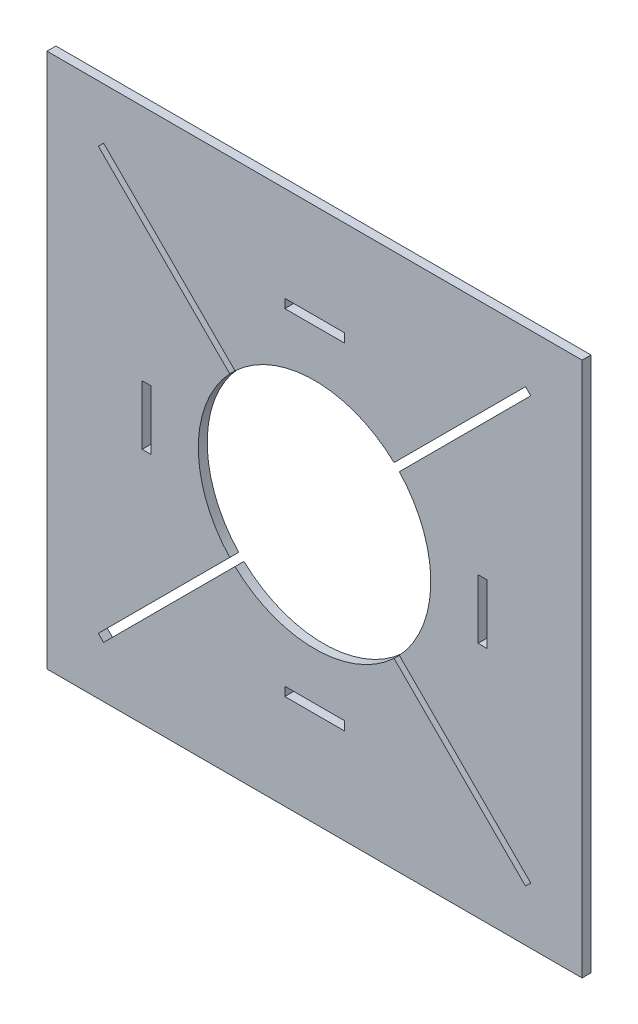
ISO-10303-21;
HEADER;
FILE_DESCRIPTION(('STEP AP214'),'2;1');
FILE_NAME('part.step','',(''),(''),'','','');
FILE_SCHEMA(('AUTOMOTIVE_DESIGN { 1 0 10303 214 1 1 1 1 }'));
ENDSEC;
DATA;
#1=APPLICATION_CONTEXT('core data for automotive mechanical design processes');
#2=APPLICATION_PROTOCOL_DEFINITION('international standard','automotive_design',2000,#1);
#3=PRODUCT_CONTEXT('',#1,'mechanical');
#4=PRODUCT('Part','Part','',(#3));
#5=PRODUCT_RELATED_PRODUCT_CATEGORY('part','',(#4));
#6=PRODUCT_DEFINITION_FORMATION('','',#4);
#7=PRODUCT_DEFINITION_CONTEXT('part definition',#1,'design');
#8=PRODUCT_DEFINITION('design','',#6,#7);
#9=PRODUCT_DEFINITION_SHAPE('','',#8);
#10=(LENGTH_UNIT() NAMED_UNIT(*) SI_UNIT(.MILLI.,.METRE.));
#11=(NAMED_UNIT(*) PLANE_ANGLE_UNIT() SI_UNIT($,.RADIAN.));
#12=(NAMED_UNIT(*) SI_UNIT($,.STERADIAN.) SOLID_ANGLE_UNIT());
#13=UNCERTAINTY_MEASURE_WITH_UNIT(LENGTH_MEASURE(1.E-05),#10,'distance_accuracy_value','');
#14=(GEOMETRIC_REPRESENTATION_CONTEXT(3) GLOBAL_UNCERTAINTY_ASSIGNED_CONTEXT((#13)) GLOBAL_UNIT_ASSIGNED_CONTEXT((#10,
#11,#12)) REPRESENTATION_CONTEXT('',''));
#15=CARTESIAN_POINT('',(0.,0.,0.));
#16=DIRECTION('',(0.,0.,1.));
#17=DIRECTION('',(1.,0.,0.));
#18=AXIS2_PLACEMENT_3D('',#15,#16,#17);
#19=CARTESIAN_POINT('',(0.,0.,0.));
#20=DIRECTION('',(0.,0.,1.));
#21=DIRECTION('',(1.,0.,0.));
#22=AXIS2_PLACEMENT_3D('',#19,#20,#21);
#23=CYLINDRICAL_SURFACE('',#22,78.2);
#24=CARTESIAN_POINT('',(0.,0.,0.));
#25=DIRECTION('',(0.,0.,1.));
#26=DIRECTION('',(1.,0.,0.));
#27=AXIS2_PLACEMENT_3D('',#24,#25,#26);
#28=CIRCLE('',#27,78.2);
#29=CARTESIAN_POINT('',(-53.4997189677804,-57.0352528737141,0.));
#30=VERTEX_POINT('',#29);
#31=CARTESIAN_POINT('',(53.4997189677812,-57.0352528737133,0.));
#32=VERTEX_POINT('',#31);
#33=EDGE_CURVE('E505',#30,#32,#28,.T.);
#34=ORIENTED_EDGE('',*,*,#33,.F.);
#35=DIRECTION('',(0.,0.,1.));
#36=VECTOR('',#35,1.);
#37=CARTESIAN_POINT('',(-53.4997189677804,-57.0352528737141,0.));
#38=LINE('',#37,#36);
#39=CARTESIAN_POINT('',(-53.4997189677804,-57.0352528737141,6.));
#40=VERTEX_POINT('',#39);
#41=EDGE_CURVE('E415',#30,#40,#38,.T.);
#42=ORIENTED_EDGE('',*,*,#41,.T.);
#43=CARTESIAN_POINT('',(0.,0.,6.));
#44=DIRECTION('',(0.,0.,1.));
#45=DIRECTION('',(1.,0.,0.));
#46=AXIS2_PLACEMENT_3D('',#43,#44,#45);
#47=CIRCLE('',#46,78.2);
#48=CARTESIAN_POINT('',(53.4997189677812,-57.0352528737133,6.));
#49=VERTEX_POINT('',#48);
#50=EDGE_CURVE('E510',#40,#49,#47,.T.);
#51=ORIENTED_EDGE('',*,*,#50,.T.);
#52=DIRECTION('',(0.,0.,1.));
#53=VECTOR('',#52,1.);
#54=CARTESIAN_POINT('',(53.4997189677812,-57.0352528737133,0.));
#55=LINE('',#54,#53);
#56=EDGE_CURVE('E434',#32,#49,#55,.T.);
#57=ORIENTED_EDGE('',*,*,#56,.F.);
#58=EDGE_LOOP('',(#34,#42,#51,#57));
#59=FACE_BOUND('',#58,.T.);
#60=ADVANCED_FACE('F33',(#59),#23,.F.);
#61=CARTESIAN_POINT('',(57.0352528737139,-53.4997189677806,0.));
#62=VERTEX_POINT('',#61);
#63=CARTESIAN_POINT('',(57.0352528737128,53.4997189677818,0.));
#64=VERTEX_POINT('',#63);
#65=EDGE_CURVE('E593',#62,#64,#28,.T.);
#66=ORIENTED_EDGE('',*,*,#65,.F.);
#67=DIRECTION('',(0.,0.,1.));
#68=VECTOR('',#67,1.);
#69=CARTESIAN_POINT('',(57.0352528737139,-53.4997189677806,0.));
#70=LINE('',#69,#68);
#71=CARTESIAN_POINT('',(57.0352528737139,-53.4997189677806,6.));
#72=VERTEX_POINT('',#71);
#73=EDGE_CURVE('E411',#62,#72,#70,.T.);
#74=ORIENTED_EDGE('',*,*,#73,.T.);
#75=CARTESIAN_POINT('',(57.0352528737128,53.4997189677818,6.));
#76=VERTEX_POINT('',#75);
#77=EDGE_CURVE('E616',#72,#76,#47,.T.);
#78=ORIENTED_EDGE('',*,*,#77,.T.);
#79=DIRECTION('',(0.,0.,1.));
#80=VECTOR('',#79,1.);
#81=CARTESIAN_POINT('',(57.0352528737128,53.4997189677818,0.));
#82=LINE('',#81,#80);
#83=EDGE_CURVE('E460',#64,#76,#82,.T.);
#84=ORIENTED_EDGE('',*,*,#83,.F.);
#85=EDGE_LOOP('',(#66,#74,#78,#84));
#86=FACE_BOUND('',#85,.T.);
#87=ADVANCED_FACE('F562',(#86),#23,.F.);
#88=CARTESIAN_POINT('',(53.49971896778,57.0352528737145,0.));
#89=VERTEX_POINT('',#88);
#90=CARTESIAN_POINT('',(-53.4997189677812,57.0352528737133,0.));
#91=VERTEX_POINT('',#90);
#92=EDGE_CURVE('E506',#89,#91,#28,.T.);
#93=ORIENTED_EDGE('',*,*,#92,.F.);
#94=DIRECTION('',(0.,0.,1.));
#95=VECTOR('',#94,1.);
#96=CARTESIAN_POINT('',(53.49971896778,57.0352528737145,0.));
#97=LINE('',#96,#95);
#98=CARTESIAN_POINT('',(53.49971896778,57.0352528737145,6.));
#99=VERTEX_POINT('',#98);
#100=EDGE_CURVE('E439',#89,#99,#97,.T.);
#101=ORIENTED_EDGE('',*,*,#100,.T.);
#102=CARTESIAN_POINT('',(-53.4997189677812,57.0352528737133,6.));
#103=VERTEX_POINT('',#102);
#104=EDGE_CURVE('E494',#99,#103,#47,.T.);
#105=ORIENTED_EDGE('',*,*,#104,.T.);
#106=DIRECTION('',(0.,0.,1.));
#107=VECTOR('',#106,1.);
#108=CARTESIAN_POINT('',(-53.4997189677812,57.0352528737133,0.));
#109=LINE('',#108,#107);
#110=EDGE_CURVE('E484',#91,#103,#109,.T.);
#111=ORIENTED_EDGE('',*,*,#110,.F.);
#112=EDGE_LOOP('',(#93,#101,#105,#111));
#113=FACE_BOUND('',#112,.T.);
#114=ADVANCED_FACE('F560',(#113),#23,.F.);
#115=CARTESIAN_POINT('',(-180.,-180.,6.));
#116=DIRECTION('',(1.,0.,0.));
#117=DIRECTION('',(0.,0.,-1.));
#118=AXIS2_PLACEMENT_3D('',#115,#116,#117);
#119=PLANE('',#118);
#120=DIRECTION('',(0.,-1.,0.));
#121=VECTOR('',#120,1.);
#122=CARTESIAN_POINT('',(-180.,-180.,0.));
#123=LINE('',#122,#121);
#124=CARTESIAN_POINT('',(-180.,180.,0.));
#125=VERTEX_POINT('',#124);
#126=CARTESIAN_POINT('',(-180.,-180.,0.));
#127=VERTEX_POINT('',#126);
#128=EDGE_CURVE('E504',#125,#127,#123,.T.);
#129=ORIENTED_EDGE('',*,*,#128,.T.);
#130=DIRECTION('',(0.,0.,-1.));
#131=VECTOR('',#130,1.);
#132=CARTESIAN_POINT('',(-180.,-180.,6.));
#133=LINE('',#132,#131);
#134=CARTESIAN_POINT('',(-180.,-180.,6.));
#135=VERTEX_POINT('',#134);
#136=EDGE_CURVE('E11',#135,#127,#133,.T.);
#137=ORIENTED_EDGE('',*,*,#136,.F.);
#138=DIRECTION('',(0.,-1.,0.));
#139=VECTOR('',#138,1.);
#140=CARTESIAN_POINT('',(-180.,-180.,6.));
#141=LINE('',#140,#139);
#142=CARTESIAN_POINT('',(-180.,180.,6.));
#143=VERTEX_POINT('',#142);
#144=EDGE_CURVE('E511',#143,#135,#141,.T.);
#145=ORIENTED_EDGE('',*,*,#144,.F.);
#146=DIRECTION('',(0.,0.,-1.));
#147=VECTOR('',#146,1.);
#148=CARTESIAN_POINT('',(-180.,180.,6.));
#149=LINE('',#148,#147);
#150=EDGE_CURVE('E521',#143,#125,#149,.T.);
#151=ORIENTED_EDGE('',*,*,#150,.T.);
#152=EDGE_LOOP('',(#129,#137,#145,#151));
#153=FACE_BOUND('',#152,.T.);
#154=ADVANCED_FACE('F35',(#153),#119,.F.);
#155=CARTESIAN_POINT('',(-180.,-180.,6.));
#156=DIRECTION('',(0.,1.,0.));
#157=DIRECTION('',(0.,0.,1.));
#158=AXIS2_PLACEMENT_3D('',#155,#156,#157);
#159=PLANE('',#158);
#160=DIRECTION('',(1.,0.,0.));
#161=VECTOR('',#160,1.);
#162=CARTESIAN_POINT('',(-180.,-180.,0.));
#163=LINE('',#162,#161);
#164=CARTESIAN_POINT('',(180.,-180.,0.));
#165=VERTEX_POINT('',#164);
#166=EDGE_CURVE('E524',#127,#165,#163,.T.);
#167=ORIENTED_EDGE('',*,*,#166,.T.);
#168=DIRECTION('',(0.,0.,-1.));
#169=VECTOR('',#168,1.);
#170=CARTESIAN_POINT('',(180.,-180.,6.));
#171=LINE('',#170,#169);
#172=CARTESIAN_POINT('',(180.,-180.,6.));
#173=VERTEX_POINT('',#172);
#174=EDGE_CURVE('E41',#173,#165,#171,.T.);
#175=ORIENTED_EDGE('',*,*,#174,.F.);
#176=DIRECTION('',(1.,0.,0.));
#177=VECTOR('',#176,1.);
#178=CARTESIAN_POINT('',(-180.,-180.,6.));
#179=LINE('',#178,#177);
#180=EDGE_CURVE('E514',#135,#173,#179,.T.);
#181=ORIENTED_EDGE('',*,*,#180,.F.);
#182=ORIENTED_EDGE('',*,*,#136,.T.);
#183=EDGE_LOOP('',(#167,#175,#181,#182));
#184=FACE_BOUND('',#183,.T.);
#185=ADVANCED_FACE('F553',(#184),#159,.F.);
#186=CARTESIAN_POINT('',(180.,-180.,6.));
#187=DIRECTION('',(-1.,0.,0.));
#188=DIRECTION('',(0.,0.,1.));
#189=AXIS2_PLACEMENT_3D('',#186,#187,#188);
#190=PLANE('',#189);
#191=DIRECTION('',(0.,1.,0.));
#192=VECTOR('',#191,1.);
#193=CARTESIAN_POINT('',(180.,-180.,0.));
#194=LINE('',#193,#192);
#195=CARTESIAN_POINT('',(180.,180.,0.));
#196=VERTEX_POINT('',#195);
#197=EDGE_CURVE('E526',#165,#196,#194,.T.);
#198=ORIENTED_EDGE('',*,*,#197,.T.);
#199=DIRECTION('',(0.,0.,-1.));
#200=VECTOR('',#199,1.);
#201=CARTESIAN_POINT('',(180.,180.,6.));
#202=LINE('',#201,#200);
#203=CARTESIAN_POINT('',(180.,180.,6.));
#204=VERTEX_POINT('',#203);
#205=EDGE_CURVE('E531',#204,#196,#202,.T.);
#206=ORIENTED_EDGE('',*,*,#205,.F.);
#207=DIRECTION('',(0.,1.,0.));
#208=VECTOR('',#207,1.);
#209=CARTESIAN_POINT('',(180.,-180.,6.));
#210=LINE('',#209,#208);
#211=EDGE_CURVE('E517',#173,#204,#210,.T.);
#212=ORIENTED_EDGE('',*,*,#211,.F.);
#213=ORIENTED_EDGE('',*,*,#174,.T.);
#214=EDGE_LOOP('',(#198,#206,#212,#213));
#215=FACE_BOUND('',#214,.T.);
#216=ADVANCED_FACE('F538',(#215),#190,.F.);
#217=CARTESIAN_POINT('',(-180.,180.,6.));
#218=DIRECTION('',(0.,-1.,0.));
#219=DIRECTION('',(0.,0.,-1.));
#220=AXIS2_PLACEMENT_3D('',#217,#218,#219);
#221=PLANE('',#220);
#222=DIRECTION('',(-1.,0.,0.));
#223=VECTOR('',#222,1.);
#224=CARTESIAN_POINT('',(-180.,180.,0.));
#225=LINE('',#224,#223);
#226=EDGE_CURVE('E515',#196,#125,#225,.T.);
#227=ORIENTED_EDGE('',*,*,#226,.T.);
#228=ORIENTED_EDGE('',*,*,#150,.F.);
#229=DIRECTION('',(-1.,0.,0.));
#230=VECTOR('',#229,1.);
#231=CARTESIAN_POINT('',(-180.,180.,6.));
#232=LINE('',#231,#230);
#233=EDGE_CURVE('E519',#204,#143,#232,.T.);
#234=ORIENTED_EDGE('',*,*,#233,.F.);
#235=ORIENTED_EDGE('',*,*,#205,.T.);
#236=EDGE_LOOP('',(#227,#228,#234,#235));
#237=FACE_BOUND('',#236,.T.);
#238=ADVANCED_FACE('F546',(#237),#221,.F.);
#239=CARTESIAN_POINT('',(0.,0.,6.));
#240=DIRECTION('',(0.,0.,-1.));
#241=DIRECTION('',(-1.,0.,0.));
#242=AXIS2_PLACEMENT_3D('',#239,#240,#241);
#243=PLANE('',#242);
#244=DIRECTION('',(0.,1.,0.));
#245=VECTOR('',#244,1.);
#246=CARTESIAN_POINT('',(-110.,-20.0000000000004,6.));
#247=LINE('',#246,#245);
#248=CARTESIAN_POINT('',(-110.,-20.0000000000004,6.));
#249=VERTEX_POINT('',#248);
#250=CARTESIAN_POINT('',(-110.,19.9999999999996,6.));
#251=VERTEX_POINT('',#250);
#252=EDGE_CURVE('E295',#249,#251,#247,.T.);
#253=ORIENTED_EDGE('',*,*,#252,.F.);
#254=DIRECTION('',(1.,0.,0.));
#255=VECTOR('',#254,1.);
#256=CARTESIAN_POINT('',(-116.,-20.0000000000004,6.));
#257=LINE('',#256,#255);
#258=CARTESIAN_POINT('',(-116.,-20.0000000000004,6.));
#259=VERTEX_POINT('',#258);
#260=EDGE_CURVE('E48',#259,#249,#257,.T.);
#261=ORIENTED_EDGE('',*,*,#260,.F.);
#262=DIRECTION('',(0.,1.,0.));
#263=VECTOR('',#262,1.);
#264=CARTESIAN_POINT('',(-116.,-20.0000000000004,6.));
#265=LINE('',#264,#263);
#266=CARTESIAN_POINT('',(-116.,19.9999999999996,6.));
#267=VERTEX_POINT('',#266);
#268=EDGE_CURVE('E286',#259,#267,#265,.T.);
#269=ORIENTED_EDGE('',*,*,#268,.T.);
#270=DIRECTION('',(1.,0.,0.));
#271=VECTOR('',#270,1.);
#272=CARTESIAN_POINT('',(-116.,19.9999999999996,6.));
#273=LINE('',#272,#271);
#274=EDGE_CURVE('E289',#267,#251,#273,.T.);
#275=ORIENTED_EDGE('',*,*,#274,.T.);
#276=EDGE_LOOP('',(#253,#261,#269,#275));
#277=FACE_BOUND('',#276,.T.);
#278=DIRECTION('',(-1.,0.,0.));
#279=VECTOR('',#278,1.);
#280=CARTESIAN_POINT('',(20.,-110.,6.));
#281=LINE('',#280,#279);
#282=CARTESIAN_POINT('',(20.,-110.,6.));
#283=VERTEX_POINT('',#282);
#284=CARTESIAN_POINT('',(-20.,-110.,6.));
#285=VERTEX_POINT('',#284);
#286=EDGE_CURVE('E320',#283,#285,#281,.T.);
#287=ORIENTED_EDGE('',*,*,#286,.F.);
#288=DIRECTION('',(0.,1.,0.));
#289=VECTOR('',#288,1.);
#290=CARTESIAN_POINT('',(20.,-116.,6.));
#291=LINE('',#290,#289);
#292=CARTESIAN_POINT('',(20.,-116.,6.));
#293=VERTEX_POINT('',#292);
#294=EDGE_CURVE('E56',#293,#283,#291,.T.);
#295=ORIENTED_EDGE('',*,*,#294,.F.);
#296=DIRECTION('',(-1.,0.,0.));
#297=VECTOR('',#296,1.);
#298=CARTESIAN_POINT('',(20.,-116.,6.));
#299=LINE('',#298,#297);
#300=CARTESIAN_POINT('',(-20.,-116.,6.));
#301=VERTEX_POINT('',#300);
#302=EDGE_CURVE('E310',#293,#301,#299,.T.);
#303=ORIENTED_EDGE('',*,*,#302,.T.);
#304=DIRECTION('',(0.,1.,0.));
#305=VECTOR('',#304,1.);
#306=CARTESIAN_POINT('',(-20.,-116.,6.));
#307=LINE('',#306,#305);
#308=EDGE_CURVE('E324',#301,#285,#307,.T.);
#309=ORIENTED_EDGE('',*,*,#308,.T.);
#310=EDGE_LOOP('',(#287,#295,#303,#309));
#311=FACE_BOUND('',#310,.T.);
#312=DIRECTION('',(0.,-1.,0.));
#313=VECTOR('',#312,1.);
#314=CARTESIAN_POINT('',(110.,20.0000000000012,6.));
#315=LINE('',#314,#313);
#316=CARTESIAN_POINT('',(110.,20.0000000000012,6.));
#317=VERTEX_POINT('',#316);
#318=CARTESIAN_POINT('',(110.,-19.9999999999988,6.));
#319=VERTEX_POINT('',#318);
#320=EDGE_CURVE('E350',#317,#319,#315,.T.);
#321=ORIENTED_EDGE('',*,*,#320,.F.);
#322=DIRECTION('',(-1.,0.,0.));
#323=VECTOR('',#322,1.);
#324=CARTESIAN_POINT('',(116.,20.0000000000012,6.));
#325=LINE('',#324,#323);
#326=CARTESIAN_POINT('',(116.,20.0000000000012,6.));
#327=VERTEX_POINT('',#326);
#328=EDGE_CURVE('E348',#327,#317,#325,.T.);
#329=ORIENTED_EDGE('',*,*,#328,.F.);
#330=DIRECTION('',(0.,-1.,0.));
#331=VECTOR('',#330,1.);
#332=CARTESIAN_POINT('',(116.,20.0000000000012,6.));
#333=LINE('',#332,#331);
#334=CARTESIAN_POINT('',(116.,-19.9999999999988,6.));
#335=VERTEX_POINT('',#334);
#336=EDGE_CURVE('E339',#327,#335,#333,.T.);
#337=ORIENTED_EDGE('',*,*,#336,.T.);
#338=DIRECTION('',(-1.,0.,0.));
#339=VECTOR('',#338,1.);
#340=CARTESIAN_POINT('',(116.,-19.9999999999988,6.));
#341=LINE('',#340,#339);
#342=EDGE_CURVE('E353',#335,#319,#341,.T.);
#343=ORIENTED_EDGE('',*,*,#342,.T.);
#344=EDGE_LOOP('',(#321,#329,#337,#343));
#345=FACE_BOUND('',#344,.T.);
#346=DIRECTION('',(1.,0.,0.));
#347=VECTOR('',#346,1.);
#348=CARTESIAN_POINT('',(-20.,110.,6.));
#349=LINE('',#348,#347);
#350=CARTESIAN_POINT('',(-20.,110.,6.));
#351=VERTEX_POINT('',#350);
#352=CARTESIAN_POINT('',(20.,110.,6.));
#353=VERTEX_POINT('',#352);
#354=EDGE_CURVE('E379',#351,#353,#349,.T.);
#355=ORIENTED_EDGE('',*,*,#354,.F.);
#356=DIRECTION('',(0.,-1.,0.));
#357=VECTOR('',#356,1.);
#358=CARTESIAN_POINT('',(-20.,116.,6.));
#359=LINE('',#358,#357);
#360=CARTESIAN_POINT('',(-20.,116.,6.));
#361=VERTEX_POINT('',#360);
#362=EDGE_CURVE('E302',#361,#351,#359,.T.);
#363=ORIENTED_EDGE('',*,*,#362,.F.);
#364=DIRECTION('',(1.,0.,0.));
#365=VECTOR('',#364,1.);
#366=CARTESIAN_POINT('',(-20.,116.,6.));
#367=LINE('',#366,#365);
#368=CARTESIAN_POINT('',(20.,116.,6.));
#369=VERTEX_POINT('',#368);
#370=EDGE_CURVE('E369',#361,#369,#367,.T.);
#371=ORIENTED_EDGE('',*,*,#370,.T.);
#372=DIRECTION('',(0.,-1.,0.));
#373=VECTOR('',#372,1.);
#374=CARTESIAN_POINT('',(20.,116.,6.));
#375=LINE('',#374,#373);
#376=EDGE_CURVE('E382',#369,#353,#375,.T.);
#377=ORIENTED_EDGE('',*,*,#376,.T.);
#378=EDGE_LOOP('',(#355,#363,#371,#377));
#379=FACE_BOUND('',#378,.T.);
#380=ORIENTED_EDGE('',*,*,#50,.F.);
#381=DIRECTION('',(0.707106781186541,0.707106781186554,0.));
#382=VECTOR('',#381,1.);
#383=CARTESIAN_POINT('',(-53.4997189677804,-57.0352528737141,6.));
#384=LINE('',#383,#382);
#385=CARTESIAN_POINT('',(-141.916330984139,-145.451864890074,6.));
#386=VERTEX_POINT('',#385);
#387=EDGE_CURVE('E400',#386,#40,#384,.T.);
#388=ORIENTED_EDGE('',*,*,#387,.F.);
#389=DIRECTION('',(0.707106781186556,-0.70710678118654,0.));
#390=VECTOR('',#389,1.);
#391=CARTESIAN_POINT('',(-141.916330984139,-145.451864890074,6.));
#392=LINE('',#391,#390);
#393=CARTESIAN_POINT('',(-145.451864890072,-141.916330984141,6.));
#394=VERTEX_POINT('',#393);
#395=EDGE_CURVE('E410',#394,#386,#392,.T.);
#396=ORIENTED_EDGE('',*,*,#395,.F.);
#397=DIRECTION('',(-0.707106781186541,-0.707106781186554,0.));
#398=VECTOR('',#397,1.);
#399=CARTESIAN_POINT('',(-145.451864890072,-141.916330984141,6.));
#400=LINE('',#399,#398);
#401=CARTESIAN_POINT('',(-57.0352528737131,-53.4997189677814,6.));
#402=VERTEX_POINT('',#401);
#403=EDGE_CURVE('E407',#402,#394,#400,.T.);
#404=ORIENTED_EDGE('',*,*,#403,.F.);
#405=CARTESIAN_POINT('',(-57.0352528737139,53.4997189677806,6.));
#406=VERTEX_POINT('',#405);
#407=EDGE_CURVE('E507',#406,#402,#47,.T.);
#408=ORIENTED_EDGE('',*,*,#407,.F.);
#409=DIRECTION('',(0.707106781186551,-0.707106781186544,0.));
#410=VECTOR('',#409,1.);
#411=CARTESIAN_POINT('',(-57.0352528737139,53.4997189677806,6.));
#412=LINE('',#411,#410);
#413=CARTESIAN_POINT('',(-145.451864890074,141.916330984139,6.));
#414=VERTEX_POINT('',#413);
#415=EDGE_CURVE('E478',#414,#406,#412,.T.);
#416=ORIENTED_EDGE('',*,*,#415,.F.);
#417=DIRECTION('',(-0.707106781186542,-0.707106781186553,0.));
#418=VECTOR('',#417,1.);
#419=CARTESIAN_POINT('',(-145.451864890074,141.916330984139,6.));
#420=LINE('',#419,#418);
#421=CARTESIAN_POINT('',(-141.916330984141,145.451864890072,6.));
#422=VERTEX_POINT('',#421);
#423=EDGE_CURVE('E487',#422,#414,#420,.T.);
#424=ORIENTED_EDGE('',*,*,#423,.F.);
#425=DIRECTION('',(-0.707106781186551,0.707106781186543,0.));
#426=VECTOR('',#425,1.);
#427=CARTESIAN_POINT('',(-141.916330984141,145.451864890072,6.));
#428=LINE('',#427,#426);
#429=EDGE_CURVE('E418',#103,#422,#428,.T.);
#430=ORIENTED_EDGE('',*,*,#429,.F.);
#431=ORIENTED_EDGE('',*,*,#104,.F.);
#432=DIRECTION('',(-0.707106781186536,-0.707106781186559,0.));
#433=VECTOR('',#432,1.);
#434=CARTESIAN_POINT('',(53.49971896778,57.0352528737145,6.));
#435=LINE('',#434,#433);
#436=CARTESIAN_POINT('',(141.916330984138,145.451864890075,6.));
#437=VERTEX_POINT('',#436);
#438=EDGE_CURVE('E454',#437,#99,#435,.T.);
#439=ORIENTED_EDGE('',*,*,#438,.F.);
#440=DIRECTION('',(-0.707106781186561,0.707106781186535,0.));
#441=VECTOR('',#440,1.);
#442=CARTESIAN_POINT('',(141.916330984138,145.451864890075,6.));
#443=LINE('',#442,#441);
#444=CARTESIAN_POINT('',(145.451864890071,141.916330984142,6.));
#445=VERTEX_POINT('',#444);
#446=EDGE_CURVE('E463',#445,#437,#443,.T.);
#447=ORIENTED_EDGE('',*,*,#446,.F.);
#448=DIRECTION('',(0.707106781186536,0.707106781186559,0.));
#449=VECTOR('',#448,1.);
#450=CARTESIAN_POINT('',(145.451864890071,141.916330984142,6.));
#451=LINE('',#450,#449);
#452=EDGE_CURVE('E389',#76,#445,#451,.T.);
#453=ORIENTED_EDGE('',*,*,#452,.F.);
#454=ORIENTED_EDGE('',*,*,#77,.F.);
#455=DIRECTION('',(-0.707106781186551,0.707106781186544,0.));
#456=VECTOR('',#455,1.);
#457=CARTESIAN_POINT('',(57.0352528737139,-53.4997189677806,6.));
#458=LINE('',#457,#456);
#459=CARTESIAN_POINT('',(145.451864890074,-141.916330984139,6.));
#460=VERTEX_POINT('',#459);
#461=EDGE_CURVE('E428',#460,#72,#458,.T.);
#462=ORIENTED_EDGE('',*,*,#461,.F.);
#463=DIRECTION('',(0.707106781186542,0.707106781186553,0.));
#464=VECTOR('',#463,1.);
#465=CARTESIAN_POINT('',(145.451864890074,-141.916330984139,6.));
#466=LINE('',#465,#464);
#467=CARTESIAN_POINT('',(141.916330984141,-145.451864890072,6.));
#468=VERTEX_POINT('',#467);
#469=EDGE_CURVE('E438',#468,#460,#466,.T.);
#470=ORIENTED_EDGE('',*,*,#469,.F.);
#471=DIRECTION('',(0.707106781186551,-0.707106781186543,0.));
#472=VECTOR('',#471,1.);
#473=CARTESIAN_POINT('',(141.916330984141,-145.451864890072,6.));
#474=LINE('',#473,#472);
#475=EDGE_CURVE('E435',#49,#468,#474,.T.);
#476=ORIENTED_EDGE('',*,*,#475,.F.);
#477=EDGE_LOOP('',(#380,#388,#396,#404,#408,#416,#424,#430,#431,#439,#447,#453,#454,#462,#470,#476));
#478=FACE_BOUND('',#477,.T.);
#479=ORIENTED_EDGE('',*,*,#144,.T.);
#480=ORIENTED_EDGE('',*,*,#180,.T.);
#481=ORIENTED_EDGE('',*,*,#211,.T.);
#482=ORIENTED_EDGE('',*,*,#233,.T.);
#483=EDGE_LOOP('',(#479,#480,#481,#482));
#484=FACE_BOUND('',#483,.T.);
#485=ADVANCED_FACE('F552',(#277,#311,#345,#379,#478,#484),#243,.F.);
#486=CARTESIAN_POINT('',(0.,0.,0.));
#487=DIRECTION('',(0.,0.,-1.));
#488=DIRECTION('',(-1.,0.,0.));
#489=AXIS2_PLACEMENT_3D('',#486,#487,#488);
#490=PLANE('',#489);
#491=DIRECTION('',(1.,0.,0.));
#492=VECTOR('',#491,1.);
#493=CARTESIAN_POINT('',(-116.,-20.0000000000004,0.));
#494=LINE('',#493,#492);
#495=CARTESIAN_POINT('',(-116.,-20.0000000000004,0.));
#496=VERTEX_POINT('',#495);
#497=CARTESIAN_POINT('',(-110.,-20.0000000000004,0.));
#498=VERTEX_POINT('',#497);
#499=EDGE_CURVE('E268',#496,#498,#494,.T.);
#500=ORIENTED_EDGE('',*,*,#499,.T.);
#501=DIRECTION('',(0.,1.,0.));
#502=VECTOR('',#501,1.);
#503=CARTESIAN_POINT('',(-110.,-20.0000000000004,0.));
#504=LINE('',#503,#502);
#505=CARTESIAN_POINT('',(-110.,19.9999999999996,0.));
#506=VERTEX_POINT('',#505);
#507=EDGE_CURVE('E277',#498,#506,#504,.T.);
#508=ORIENTED_EDGE('',*,*,#507,.T.);
#509=DIRECTION('',(1.,0.,0.));
#510=VECTOR('',#509,1.);
#511=CARTESIAN_POINT('',(-116.,19.9999999999996,0.));
#512=LINE('',#511,#510);
#513=CARTESIAN_POINT('',(-116.,19.9999999999996,0.));
#514=VERTEX_POINT('',#513);
#515=EDGE_CURVE('E282',#514,#506,#512,.T.);
#516=ORIENTED_EDGE('',*,*,#515,.F.);
#517=DIRECTION('',(0.,1.,0.));
#518=VECTOR('',#517,1.);
#519=CARTESIAN_POINT('',(-116.,-20.0000000000004,0.));
#520=LINE('',#519,#518);
#521=EDGE_CURVE('E274',#496,#514,#520,.T.);
#522=ORIENTED_EDGE('',*,*,#521,.F.);
#523=EDGE_LOOP('',(#500,#508,#516,#522));
#524=FACE_BOUND('',#523,.T.);
#525=DIRECTION('',(0.,1.,0.));
#526=VECTOR('',#525,1.);
#527=CARTESIAN_POINT('',(20.,-116.,0.));
#528=LINE('',#527,#526);
#529=CARTESIAN_POINT('',(20.,-116.,0.));
#530=VERTEX_POINT('',#529);
#531=CARTESIAN_POINT('',(20.,-110.,0.));
#532=VERTEX_POINT('',#531);
#533=EDGE_CURVE('E306',#530,#532,#528,.T.);
#534=ORIENTED_EDGE('',*,*,#533,.T.);
#535=DIRECTION('',(-1.,0.,0.));
#536=VECTOR('',#535,1.);
#537=CARTESIAN_POINT('',(20.,-110.,0.));
#538=LINE('',#537,#536);
#539=CARTESIAN_POINT('',(-20.,-110.,0.));
#540=VERTEX_POINT('',#539);
#541=EDGE_CURVE('E309',#532,#540,#538,.T.);
#542=ORIENTED_EDGE('',*,*,#541,.T.);
#543=DIRECTION('',(0.,1.,0.));
#544=VECTOR('',#543,1.);
#545=CARTESIAN_POINT('',(-20.,-116.,0.));
#546=LINE('',#545,#544);
#547=CARTESIAN_POINT('',(-20.,-116.,0.));
#548=VERTEX_POINT('',#547);
#549=EDGE_CURVE('E313',#548,#540,#546,.T.);
#550=ORIENTED_EDGE('',*,*,#549,.F.);
#551=DIRECTION('',(-1.,0.,0.));
#552=VECTOR('',#551,1.);
#553=CARTESIAN_POINT('',(20.,-116.,0.));
#554=LINE('',#553,#552);
#555=EDGE_CURVE('E316',#530,#548,#554,.T.);
#556=ORIENTED_EDGE('',*,*,#555,.F.);
#557=EDGE_LOOP('',(#534,#542,#550,#556));
#558=FACE_BOUND('',#557,.T.);
#559=DIRECTION('',(-1.,0.,0.));
#560=VECTOR('',#559,1.);
#561=CARTESIAN_POINT('',(116.,20.0000000000012,0.));
#562=LINE('',#561,#560);
#563=CARTESIAN_POINT('',(116.,20.0000000000012,0.));
#564=VERTEX_POINT('',#563);
#565=CARTESIAN_POINT('',(110.,20.0000000000012,0.));
#566=VERTEX_POINT('',#565);
#567=EDGE_CURVE('E335',#564,#566,#562,.T.);
#568=ORIENTED_EDGE('',*,*,#567,.T.);
#569=DIRECTION('',(0.,-1.,0.));
#570=VECTOR('',#569,1.);
#571=CARTESIAN_POINT('',(110.,20.0000000000012,0.));
#572=LINE('',#571,#570);
#573=CARTESIAN_POINT('',(110.,-19.9999999999988,0.));
#574=VERTEX_POINT('',#573);
#575=EDGE_CURVE('E338',#566,#574,#572,.T.);
#576=ORIENTED_EDGE('',*,*,#575,.T.);
#577=DIRECTION('',(-1.,0.,0.));
#578=VECTOR('',#577,1.);
#579=CARTESIAN_POINT('',(116.,-19.9999999999988,0.));
#580=LINE('',#579,#578);
#581=CARTESIAN_POINT('',(116.,-19.9999999999988,0.));
#582=VERTEX_POINT('',#581);
#583=EDGE_CURVE('E342',#582,#574,#580,.T.);
#584=ORIENTED_EDGE('',*,*,#583,.F.);
#585=DIRECTION('',(0.,-1.,0.));
#586=VECTOR('',#585,1.);
#587=CARTESIAN_POINT('',(116.,20.0000000000012,0.));
#588=LINE('',#587,#586);
#589=EDGE_CURVE('E345',#564,#582,#588,.T.);
#590=ORIENTED_EDGE('',*,*,#589,.F.);
#591=EDGE_LOOP('',(#568,#576,#584,#590));
#592=FACE_BOUND('',#591,.T.);
#593=DIRECTION('',(0.,-1.,0.));
#594=VECTOR('',#593,1.);
#595=CARTESIAN_POINT('',(-20.,116.,0.));
#596=LINE('',#595,#594);
#597=CARTESIAN_POINT('',(-20.,116.,0.));
#598=VERTEX_POINT('',#597);
#599=CARTESIAN_POINT('',(-20.,110.,0.));
#600=VERTEX_POINT('',#599);
#601=EDGE_CURVE('E365',#598,#600,#596,.T.);
#602=ORIENTED_EDGE('',*,*,#601,.T.);
#603=DIRECTION('',(1.,0.,0.));
#604=VECTOR('',#603,1.);
#605=CARTESIAN_POINT('',(-20.,110.,0.));
#606=LINE('',#605,#604);
#607=CARTESIAN_POINT('',(20.,110.,0.));
#608=VERTEX_POINT('',#607);
#609=EDGE_CURVE('E368',#600,#608,#606,.T.);
#610=ORIENTED_EDGE('',*,*,#609,.T.);
#611=DIRECTION('',(0.,-1.,0.));
#612=VECTOR('',#611,1.);
#613=CARTESIAN_POINT('',(20.,116.,0.));
#614=LINE('',#613,#612);
#615=CARTESIAN_POINT('',(20.,116.,0.));
#616=VERTEX_POINT('',#615);
#617=EDGE_CURVE('E372',#616,#608,#614,.T.);
#618=ORIENTED_EDGE('',*,*,#617,.F.);
#619=DIRECTION('',(1.,0.,0.));
#620=VECTOR('',#619,1.);
#621=CARTESIAN_POINT('',(-20.,116.,0.));
#622=LINE('',#621,#620);
#623=EDGE_CURVE('E375',#598,#616,#622,.T.);
#624=ORIENTED_EDGE('',*,*,#623,.F.);
#625=EDGE_LOOP('',(#602,#610,#618,#624));
#626=FACE_BOUND('',#625,.T.);
#627=DIRECTION('',(0.707106781186541,0.707106781186554,0.));
#628=VECTOR('',#627,1.);
#629=CARTESIAN_POINT('',(-53.4997189677804,-57.0352528737141,0.));
#630=LINE('',#629,#628);
#631=CARTESIAN_POINT('',(-141.916330984139,-145.451864890074,0.));
#632=VERTEX_POINT('',#631);
#633=EDGE_CURVE('E403',#632,#30,#630,.T.);
#634=ORIENTED_EDGE('',*,*,#633,.T.);
#635=ORIENTED_EDGE('',*,*,#33,.T.);
#636=DIRECTION('',(0.707106781186551,-0.707106781186543,0.));
#637=VECTOR('',#636,1.);
#638=CARTESIAN_POINT('',(141.916330984141,-145.451864890072,0.));
#639=LINE('',#638,#637);
#640=CARTESIAN_POINT('',(141.916330984141,-145.451864890072,0.));
#641=VERTEX_POINT('',#640);
#642=EDGE_CURVE('E424',#32,#641,#639,.T.);
#643=ORIENTED_EDGE('',*,*,#642,.T.);
#644=DIRECTION('',(0.707106781186542,0.707106781186553,0.));
#645=VECTOR('',#644,1.);
#646=CARTESIAN_POINT('',(145.451864890074,-141.916330984139,0.));
#647=LINE('',#646,#645);
#648=CARTESIAN_POINT('',(145.451864890074,-141.916330984139,0.));
#649=VERTEX_POINT('',#648);
#650=EDGE_CURVE('E427',#641,#649,#647,.T.);
#651=ORIENTED_EDGE('',*,*,#650,.T.);
#652=DIRECTION('',(-0.707106781186551,0.707106781186544,0.));
#653=VECTOR('',#652,1.);
#654=CARTESIAN_POINT('',(57.0352528737139,-53.4997189677806,0.));
#655=LINE('',#654,#653);
#656=EDGE_CURVE('E431',#649,#62,#655,.T.);
#657=ORIENTED_EDGE('',*,*,#656,.T.);
#658=ORIENTED_EDGE('',*,*,#65,.T.);
#659=DIRECTION('',(0.707106781186536,0.707106781186559,0.));
#660=VECTOR('',#659,1.);
#661=CARTESIAN_POINT('',(145.451864890071,141.916330984142,0.));
#662=LINE('',#661,#660);
#663=CARTESIAN_POINT('',(145.451864890071,141.916330984142,0.));
#664=VERTEX_POINT('',#663);
#665=EDGE_CURVE('E450',#64,#664,#662,.T.);
#666=ORIENTED_EDGE('',*,*,#665,.T.);
#667=DIRECTION('',(-0.707106781186561,0.707106781186535,0.));
#668=VECTOR('',#667,1.);
#669=CARTESIAN_POINT('',(141.916330984138,145.451864890075,0.));
#670=LINE('',#669,#668);
#671=CARTESIAN_POINT('',(141.916330984138,145.451864890075,0.));
#672=VERTEX_POINT('',#671);
#673=EDGE_CURVE('E453',#664,#672,#670,.T.);
#674=ORIENTED_EDGE('',*,*,#673,.T.);
#675=DIRECTION('',(-0.707106781186536,-0.707106781186559,0.));
#676=VECTOR('',#675,1.);
#677=CARTESIAN_POINT('',(53.49971896778,57.0352528737145,0.));
#678=LINE('',#677,#676);
#679=EDGE_CURVE('E457',#672,#89,#678,.T.);
#680=ORIENTED_EDGE('',*,*,#679,.T.);
#681=ORIENTED_EDGE('',*,*,#92,.T.);
#682=DIRECTION('',(-0.707106781186551,0.707106781186543,0.));
#683=VECTOR('',#682,1.);
#684=CARTESIAN_POINT('',(-141.916330984141,145.451864890072,0.));
#685=LINE('',#684,#683);
#686=CARTESIAN_POINT('',(-141.916330984141,145.451864890072,0.));
#687=VERTEX_POINT('',#686);
#688=EDGE_CURVE('E474',#91,#687,#685,.T.);
#689=ORIENTED_EDGE('',*,*,#688,.T.);
#690=DIRECTION('',(-0.707106781186542,-0.707106781186553,0.));
#691=VECTOR('',#690,1.);
#692=CARTESIAN_POINT('',(-145.451864890074,141.916330984139,0.));
#693=LINE('',#692,#691);
#694=CARTESIAN_POINT('',(-145.451864890074,141.916330984139,0.));
#695=VERTEX_POINT('',#694);
#696=EDGE_CURVE('E477',#687,#695,#693,.T.);
#697=ORIENTED_EDGE('',*,*,#696,.T.);
#698=DIRECTION('',(0.707106781186551,-0.707106781186544,0.));
#699=VECTOR('',#698,1.);
#700=CARTESIAN_POINT('',(-57.0352528737139,53.4997189677806,0.));
#701=LINE('',#700,#699);
#702=CARTESIAN_POINT('',(-57.0352528737139,53.4997189677806,0.));
#703=VERTEX_POINT('',#702);
#704=EDGE_CURVE('E481',#695,#703,#701,.T.);
#705=ORIENTED_EDGE('',*,*,#704,.T.);
#706=CARTESIAN_POINT('',(-57.0352528737132,-53.4997189677814,0.));
#707=VERTEX_POINT('',#706);
#708=EDGE_CURVE('E501',#703,#707,#28,.T.);
#709=ORIENTED_EDGE('',*,*,#708,.T.);
#710=DIRECTION('',(-0.707106781186541,-0.707106781186554,0.));
#711=VECTOR('',#710,1.);
#712=CARTESIAN_POINT('',(-145.451864890072,-141.916330984141,0.));
#713=LINE('',#712,#711);
#714=CARTESIAN_POINT('',(-145.451864890072,-141.916330984141,0.));
#715=VERTEX_POINT('',#714);
#716=EDGE_CURVE('E396',#707,#715,#713,.T.);
#717=ORIENTED_EDGE('',*,*,#716,.T.);
#718=DIRECTION('',(0.707106781186556,-0.70710678118654,0.));
#719=VECTOR('',#718,1.);
#720=CARTESIAN_POINT('',(-141.916330984139,-145.451864890074,0.));
#721=LINE('',#720,#719);
#722=EDGE_CURVE('E399',#715,#632,#721,.T.);
#723=ORIENTED_EDGE('',*,*,#722,.T.);
#724=EDGE_LOOP('',(#634,#635,#643,#651,#657,#658,#666,#674,#680,#681,#689,#697,#705,#709,#717,#723));
#725=FACE_BOUND('',#724,.T.);
#726=ORIENTED_EDGE('',*,*,#128,.F.);
#727=ORIENTED_EDGE('',*,*,#226,.F.);
#728=ORIENTED_EDGE('',*,*,#197,.F.);
#729=ORIENTED_EDGE('',*,*,#166,.F.);
#730=EDGE_LOOP('',(#726,#727,#728,#729));
#731=FACE_BOUND('',#730,.T.);
#732=ADVANCED_FACE('F284',(#524,#558,#592,#626,#725,#731),#490,.T.);
#733=ORIENTED_EDGE('',*,*,#407,.T.);
#734=DIRECTION('',(0.,0.,1.));
#735=VECTOR('',#734,1.);
#736=CARTESIAN_POINT('',(-57.0352528737131,-53.4997189677814,0.));
#737=LINE('',#736,#735);
#738=EDGE_CURVE('E406',#707,#402,#737,.T.);
#739=ORIENTED_EDGE('',*,*,#738,.F.);
#740=ORIENTED_EDGE('',*,*,#708,.F.);
#741=DIRECTION('',(0.,0.,1.));
#742=VECTOR('',#741,1.);
#743=CARTESIAN_POINT('',(-57.0352528737139,53.4997189677806,0.));
#744=LINE('',#743,#742);
#745=EDGE_CURVE('E491',#703,#406,#744,.T.);
#746=ORIENTED_EDGE('',*,*,#745,.T.);
#747=EDGE_LOOP('',(#733,#739,#740,#746));
#748=FACE_BOUND('',#747,.T.);
#749=ADVANCED_FACE('F565',(#748),#23,.F.);
#750=CARTESIAN_POINT('',(-57.0352528737139,53.4997189677806,0.));
#751=DIRECTION('',(-0.707106781186544,-0.707106781186551,0.));
#752=DIRECTION('',(0.707106781186551,-0.707106781186544,0.));
#753=AXIS2_PLACEMENT_3D('',#750,#751,#752);
#754=PLANE('',#753);
#755=ORIENTED_EDGE('',*,*,#415,.T.);
#756=ORIENTED_EDGE('',*,*,#745,.F.);
#757=ORIENTED_EDGE('',*,*,#704,.F.);
#758=DIRECTION('',(0.,0.,1.));
#759=VECTOR('',#758,1.);
#760=CARTESIAN_POINT('',(-145.451864890074,141.916330984139,0.));
#761=LINE('',#760,#759);
#762=EDGE_CURVE('E495',#695,#414,#761,.T.);
#763=ORIENTED_EDGE('',*,*,#762,.T.);
#764=EDGE_LOOP('',(#755,#756,#757,#763));
#765=FACE_BOUND('',#764,.T.);
#766=ADVANCED_FACE('F574',(#765),#754,.F.);
#767=CARTESIAN_POINT('',(-145.451864890074,141.916330984139,0.));
#768=DIRECTION('',(-0.707106781186553,0.707106781186542,0.));
#769=DIRECTION('',(-0.707106781186542,-0.707106781186553,0.));
#770=AXIS2_PLACEMENT_3D('',#767,#768,#769);
#771=PLANE('',#770);
#772=ORIENTED_EDGE('',*,*,#423,.T.);
#773=ORIENTED_EDGE('',*,*,#762,.F.);
#774=ORIENTED_EDGE('',*,*,#696,.F.);
#775=DIRECTION('',(0.,0.,1.));
#776=VECTOR('',#775,1.);
#777=CARTESIAN_POINT('',(-141.916330984141,145.451864890072,0.));
#778=LINE('',#777,#776);
#779=EDGE_CURVE('E497',#687,#422,#778,.T.);
#780=ORIENTED_EDGE('',*,*,#779,.T.);
#781=EDGE_LOOP('',(#772,#773,#774,#780));
#782=FACE_BOUND('',#781,.T.);
#783=ADVANCED_FACE('F580',(#782),#771,.F.);
#784=CARTESIAN_POINT('',(-141.916330984141,145.451864890072,0.));
#785=DIRECTION('',(0.707106781186543,0.707106781186552,0.));
#786=DIRECTION('',(-0.707106781186552,0.707106781186543,0.));
#787=AXIS2_PLACEMENT_3D('',#784,#785,#786);
#788=PLANE('',#787);
#789=ORIENTED_EDGE('',*,*,#429,.T.);
#790=ORIENTED_EDGE('',*,*,#779,.F.);
#791=ORIENTED_EDGE('',*,*,#688,.F.);
#792=ORIENTED_EDGE('',*,*,#110,.T.);
#793=EDGE_LOOP('',(#789,#790,#791,#792));
#794=FACE_BOUND('',#793,.T.);
#795=ADVANCED_FACE('F629',(#794),#788,.F.);
#796=CARTESIAN_POINT('',(53.49971896778,57.0352528737145,0.));
#797=DIRECTION('',(-0.707106781186559,0.707106781186536,0.));
#798=DIRECTION('',(-0.707106781186536,-0.707106781186559,0.));
#799=AXIS2_PLACEMENT_3D('',#796,#797,#798);
#800=PLANE('',#799);
#801=ORIENTED_EDGE('',*,*,#438,.T.);
#802=ORIENTED_EDGE('',*,*,#100,.F.);
#803=ORIENTED_EDGE('',*,*,#679,.F.);
#804=DIRECTION('',(0.,0.,1.));
#805=VECTOR('',#804,1.);
#806=CARTESIAN_POINT('',(141.916330984138,145.451864890075,0.));
#807=LINE('',#806,#805);
#808=EDGE_CURVE('E469',#672,#437,#807,.T.);
#809=ORIENTED_EDGE('',*,*,#808,.T.);
#810=EDGE_LOOP('',(#801,#802,#803,#809));
#811=FACE_BOUND('',#810,.T.);
#812=ADVANCED_FACE('F627',(#811),#800,.F.);
#813=CARTESIAN_POINT('',(141.916330984138,145.451864890075,0.));
#814=DIRECTION('',(0.707106781186534,0.70710678118656,0.));
#815=DIRECTION('',(-0.707106781186561,0.707106781186535,0.));
#816=AXIS2_PLACEMENT_3D('',#813,#814,#815);
#817=PLANE('',#816);
#818=ORIENTED_EDGE('',*,*,#446,.T.);
#819=ORIENTED_EDGE('',*,*,#808,.F.);
#820=ORIENTED_EDGE('',*,*,#673,.F.);
#821=DIRECTION('',(0.,0.,1.));
#822=VECTOR('',#821,1.);
#823=CARTESIAN_POINT('',(145.451864890071,141.916330984142,0.));
#824=LINE('',#823,#822);
#825=EDGE_CURVE('E471',#664,#445,#824,.T.);
#826=ORIENTED_EDGE('',*,*,#825,.T.);
#827=EDGE_LOOP('',(#818,#819,#820,#826));
#828=FACE_BOUND('',#827,.T.);
#829=ADVANCED_FACE('F623',(#828),#817,.F.);
#830=CARTESIAN_POINT('',(145.451864890071,141.916330984142,0.));
#831=DIRECTION('',(0.707106781186559,-0.707106781186536,0.));
#832=DIRECTION('',(0.707106781186536,0.707106781186559,0.));
#833=AXIS2_PLACEMENT_3D('',#830,#831,#832);
#834=PLANE('',#833);
#835=ORIENTED_EDGE('',*,*,#452,.T.);
#836=ORIENTED_EDGE('',*,*,#825,.F.);
#837=ORIENTED_EDGE('',*,*,#665,.F.);
#838=ORIENTED_EDGE('',*,*,#83,.T.);
#839=EDGE_LOOP('',(#835,#836,#837,#838));
#840=FACE_BOUND('',#839,.T.);
#841=ADVANCED_FACE('F619',(#840),#834,.F.);
#842=CARTESIAN_POINT('',(57.0352528737139,-53.4997189677806,0.));
#843=DIRECTION('',(0.707106781186544,0.707106781186551,0.));
#844=DIRECTION('',(-0.707106781186551,0.707106781186544,0.));
#845=AXIS2_PLACEMENT_3D('',#842,#843,#844);
#846=PLANE('',#845);
#847=ORIENTED_EDGE('',*,*,#461,.T.);
#848=ORIENTED_EDGE('',*,*,#73,.F.);
#849=ORIENTED_EDGE('',*,*,#656,.F.);
#850=DIRECTION('',(0.,0.,1.));
#851=VECTOR('',#850,1.);
#852=CARTESIAN_POINT('',(145.451864890074,-141.916330984139,0.));
#853=LINE('',#852,#851);
#854=EDGE_CURVE('E445',#649,#460,#853,.T.);
#855=ORIENTED_EDGE('',*,*,#854,.T.);
#856=EDGE_LOOP('',(#847,#848,#849,#855));
#857=FACE_BOUND('',#856,.T.);
#858=ADVANCED_FACE('F641',(#857),#846,.F.);
#859=CARTESIAN_POINT('',(145.451864890074,-141.916330984139,0.));
#860=DIRECTION('',(0.707106781186553,-0.707106781186542,0.));
#861=DIRECTION('',(0.707106781186542,0.707106781186553,0.));
#862=AXIS2_PLACEMENT_3D('',#859,#860,#861);
#863=PLANE('',#862);
#864=ORIENTED_EDGE('',*,*,#469,.T.);
#865=ORIENTED_EDGE('',*,*,#854,.F.);
#866=ORIENTED_EDGE('',*,*,#650,.F.);
#867=DIRECTION('',(0.,0.,1.));
#868=VECTOR('',#867,1.);
#869=CARTESIAN_POINT('',(141.916330984141,-145.451864890072,0.));
#870=LINE('',#869,#868);
#871=EDGE_CURVE('E447',#641,#468,#870,.T.);
#872=ORIENTED_EDGE('',*,*,#871,.T.);
#873=EDGE_LOOP('',(#864,#865,#866,#872));
#874=FACE_BOUND('',#873,.T.);
#875=ADVANCED_FACE('F610',(#874),#863,.F.);
#876=CARTESIAN_POINT('',(141.916330984141,-145.451864890072,0.));
#877=DIRECTION('',(-0.707106781186543,-0.707106781186552,0.));
#878=DIRECTION('',(0.707106781186552,-0.707106781186543,0.));
#879=AXIS2_PLACEMENT_3D('',#876,#877,#878);
#880=PLANE('',#879);
#881=ORIENTED_EDGE('',*,*,#475,.T.);
#882=ORIENTED_EDGE('',*,*,#871,.F.);
#883=ORIENTED_EDGE('',*,*,#642,.F.);
#884=ORIENTED_EDGE('',*,*,#56,.T.);
#885=EDGE_LOOP('',(#881,#882,#883,#884));
#886=FACE_BOUND('',#885,.T.);
#887=ADVANCED_FACE('F603',(#886),#880,.F.);
#888=CARTESIAN_POINT('',(-53.4997189677804,-57.0352528737141,0.));
#889=DIRECTION('',(0.707106781186554,-0.707106781186541,0.));
#890=DIRECTION('',(0.707106781186541,0.707106781186554,0.));
#891=AXIS2_PLACEMENT_3D('',#888,#889,#890);
#892=PLANE('',#891);
#893=ORIENTED_EDGE('',*,*,#387,.T.);
#894=ORIENTED_EDGE('',*,*,#41,.F.);
#895=ORIENTED_EDGE('',*,*,#633,.F.);
#896=DIRECTION('',(0.,0.,1.));
#897=VECTOR('',#896,1.);
#898=CARTESIAN_POINT('',(-141.916330984139,-145.451864890074,0.));
#899=LINE('',#898,#897);
#900=EDGE_CURVE('E419',#632,#386,#899,.T.);
#901=ORIENTED_EDGE('',*,*,#900,.T.);
#902=EDGE_LOOP('',(#893,#894,#895,#901));
#903=FACE_BOUND('',#902,.T.);
#904=ADVANCED_FACE('F663',(#903),#892,.F.);
#905=CARTESIAN_POINT('',(-141.916330984139,-145.451864890074,0.));
#906=DIRECTION('',(-0.707106781186539,-0.707106781186555,0.));
#907=DIRECTION('',(0.707106781186556,-0.707106781186539,0.));
#908=AXIS2_PLACEMENT_3D('',#905,#906,#907);
#909=PLANE('',#908);
#910=ORIENTED_EDGE('',*,*,#395,.T.);
#911=ORIENTED_EDGE('',*,*,#900,.F.);
#912=ORIENTED_EDGE('',*,*,#722,.F.);
#913=DIRECTION('',(0.,0.,1.));
#914=VECTOR('',#913,1.);
#915=CARTESIAN_POINT('',(-145.451864890072,-141.916330984141,0.));
#916=LINE('',#915,#914);
#917=EDGE_CURVE('E421',#715,#394,#916,.T.);
#918=ORIENTED_EDGE('',*,*,#917,.T.);
#919=EDGE_LOOP('',(#910,#911,#912,#918));
#920=FACE_BOUND('',#919,.T.);
#921=ADVANCED_FACE('F661',(#920),#909,.F.);
#922=CARTESIAN_POINT('',(-145.451864890072,-141.916330984141,0.));
#923=DIRECTION('',(-0.707106781186554,0.707106781186541,0.));
#924=DIRECTION('',(-0.707106781186541,-0.707106781186554,0.));
#925=AXIS2_PLACEMENT_3D('',#922,#923,#924);
#926=PLANE('',#925);
#927=ORIENTED_EDGE('',*,*,#403,.T.);
#928=ORIENTED_EDGE('',*,*,#917,.F.);
#929=ORIENTED_EDGE('',*,*,#716,.F.);
#930=ORIENTED_EDGE('',*,*,#738,.T.);
#931=EDGE_LOOP('',(#927,#928,#929,#930));
#932=FACE_BOUND('',#931,.T.);
#933=ADVANCED_FACE('F658',(#932),#926,.F.);
#934=CARTESIAN_POINT('',(-20.,116.,0.));
#935=DIRECTION('',(-1.,0.,0.));
#936=DIRECTION('',(0.,0.,1.));
#937=AXIS2_PLACEMENT_3D('',#934,#935,#936);
#938=PLANE('',#937);
#939=ORIENTED_EDGE('',*,*,#362,.T.);
#940=DIRECTION('',(0.,0.,1.));
#941=VECTOR('',#940,1.);
#942=CARTESIAN_POINT('',(-20.,110.,0.));
#943=LINE('',#942,#941);
#944=EDGE_CURVE('E377',#600,#351,#943,.T.);
#945=ORIENTED_EDGE('',*,*,#944,.F.);
#946=ORIENTED_EDGE('',*,*,#601,.F.);
#947=DIRECTION('',(0.,0.,1.));
#948=VECTOR('',#947,1.);
#949=CARTESIAN_POINT('',(-20.,116.,0.));
#950=LINE('',#949,#948);
#951=EDGE_CURVE('E387',#598,#361,#950,.T.);
#952=ORIENTED_EDGE('',*,*,#951,.T.);
#953=EDGE_LOOP('',(#939,#945,#946,#952));
#954=FACE_BOUND('',#953,.T.);
#955=ADVANCED_FACE('F672',(#954),#938,.F.);
#956=CARTESIAN_POINT('',(-20.,116.,0.));
#957=DIRECTION('',(0.,-1.,0.));
#958=DIRECTION('',(0.,0.,-1.));
#959=AXIS2_PLACEMENT_3D('',#956,#957,#958);
#960=PLANE('',#959);
#961=ORIENTED_EDGE('',*,*,#370,.F.);
#962=ORIENTED_EDGE('',*,*,#951,.F.);
#963=ORIENTED_EDGE('',*,*,#623,.T.);
#964=DIRECTION('',(0.,0.,1.));
#965=VECTOR('',#964,1.);
#966=CARTESIAN_POINT('',(20.,116.,0.));
#967=LINE('',#966,#965);
#968=EDGE_CURVE('E390',#616,#369,#967,.T.);
#969=ORIENTED_EDGE('',*,*,#968,.T.);
#970=EDGE_LOOP('',(#961,#962,#963,#969));
#971=FACE_BOUND('',#970,.T.);
#972=ADVANCED_FACE('F712',(#971),#960,.T.);
#973=CARTESIAN_POINT('',(20.,116.,0.));
#974=DIRECTION('',(-1.,0.,0.));
#975=DIRECTION('',(0.,0.,1.));
#976=AXIS2_PLACEMENT_3D('',#973,#974,#975);
#977=PLANE('',#976);
#978=ORIENTED_EDGE('',*,*,#376,.F.);
#979=ORIENTED_EDGE('',*,*,#968,.F.);
#980=ORIENTED_EDGE('',*,*,#617,.T.);
#981=DIRECTION('',(0.,0.,1.));
#982=VECTOR('',#981,1.);
#983=CARTESIAN_POINT('',(20.,110.,0.));
#984=LINE('',#983,#982);
#985=EDGE_CURVE('E392',#608,#353,#984,.T.);
#986=ORIENTED_EDGE('',*,*,#985,.T.);
#987=EDGE_LOOP('',(#978,#979,#980,#986));
#988=FACE_BOUND('',#987,.T.);
#989=ADVANCED_FACE('F721',(#988),#977,.T.);
#990=CARTESIAN_POINT('',(-20.,110.,0.));
#991=DIRECTION('',(0.,-1.,0.));
#992=DIRECTION('',(0.,0.,-1.));
#993=AXIS2_PLACEMENT_3D('',#990,#991,#992);
#994=PLANE('',#993);
#995=ORIENTED_EDGE('',*,*,#354,.T.);
#996=ORIENTED_EDGE('',*,*,#985,.F.);
#997=ORIENTED_EDGE('',*,*,#609,.F.);
#998=ORIENTED_EDGE('',*,*,#944,.T.);
#999=EDGE_LOOP('',(#995,#996,#997,#998));
#1000=FACE_BOUND('',#999,.T.);
#1001=ADVANCED_FACE('F731',(#1000),#994,.F.);
#1002=CARTESIAN_POINT('',(116.,20.0000000000012,0.));
#1003=DIRECTION('',(0.,1.,0.));
#1004=DIRECTION('',(-1.,0.,0.));
#1005=AXIS2_PLACEMENT_3D('',#1002,#1003,#1004);
#1006=PLANE('',#1005);
#1007=ORIENTED_EDGE('',*,*,#328,.T.);
#1008=DIRECTION('',(0.,0.,1.));
#1009=VECTOR('',#1008,1.);
#1010=CARTESIAN_POINT('',(110.,20.0000000000012,0.));
#1011=LINE('',#1010,#1009);
#1012=EDGE_CURVE('E347',#566,#317,#1011,.T.);
#1013=ORIENTED_EDGE('',*,*,#1012,.F.);
#1014=ORIENTED_EDGE('',*,*,#567,.F.);
#1015=DIRECTION('',(0.,0.,1.));
#1016=VECTOR('',#1015,1.);
#1017=CARTESIAN_POINT('',(116.,20.0000000000012,0.));
#1018=LINE('',#1017,#1016);
#1019=EDGE_CURVE('E321',#564,#327,#1018,.T.);
#1020=ORIENTED_EDGE('',*,*,#1019,.T.);
#1021=EDGE_LOOP('',(#1007,#1013,#1014,#1020));
#1022=FACE_BOUND('',#1021,.T.);
#1023=ADVANCED_FACE('F741',(#1022),#1006,.F.);
#1024=CARTESIAN_POINT('',(116.,20.0000000000012,0.));
#1025=DIRECTION('',(-1.,0.,0.));
#1026=DIRECTION('',(0.,-1.,0.));
#1027=AXIS2_PLACEMENT_3D('',#1024,#1025,#1026);
#1028=PLANE('',#1027);
#1029=ORIENTED_EDGE('',*,*,#336,.F.);
#1030=ORIENTED_EDGE('',*,*,#1019,.F.);
#1031=ORIENTED_EDGE('',*,*,#589,.T.);
#1032=DIRECTION('',(0.,0.,1.));
#1033=VECTOR('',#1032,1.);
#1034=CARTESIAN_POINT('',(116.,-19.9999999999988,0.));
#1035=LINE('',#1034,#1033);
#1036=EDGE_CURVE('E359',#582,#335,#1035,.T.);
#1037=ORIENTED_EDGE('',*,*,#1036,.T.);
#1038=EDGE_LOOP('',(#1029,#1030,#1031,#1037));
#1039=FACE_BOUND('',#1038,.T.);
#1040=ADVANCED_FACE('F767',(#1039),#1028,.T.);
#1041=CARTESIAN_POINT('',(116.,-19.9999999999988,0.));
#1042=DIRECTION('',(0.,1.,0.));
#1043=DIRECTION('',(-1.,0.,0.));
#1044=AXIS2_PLACEMENT_3D('',#1041,#1042,#1043);
#1045=PLANE('',#1044);
#1046=ORIENTED_EDGE('',*,*,#342,.F.);
#1047=ORIENTED_EDGE('',*,*,#1036,.F.);
#1048=ORIENTED_EDGE('',*,*,#583,.T.);
#1049=DIRECTION('',(0.,0.,1.));
#1050=VECTOR('',#1049,1.);
#1051=CARTESIAN_POINT('',(110.,-19.9999999999988,0.));
#1052=LINE('',#1051,#1050);
#1053=EDGE_CURVE('E361',#574,#319,#1052,.T.);
#1054=ORIENTED_EDGE('',*,*,#1053,.T.);
#1055=EDGE_LOOP('',(#1046,#1047,#1048,#1054));
#1056=FACE_BOUND('',#1055,.T.);
#1057=ADVANCED_FACE('F777',(#1056),#1045,.T.);
#1058=CARTESIAN_POINT('',(110.,20.0000000000012,0.));
#1059=DIRECTION('',(-1.,0.,0.));
#1060=DIRECTION('',(0.,-1.,0.));
#1061=AXIS2_PLACEMENT_3D('',#1058,#1059,#1060);
#1062=PLANE('',#1061);
#1063=ORIENTED_EDGE('',*,*,#320,.T.);
#1064=ORIENTED_EDGE('',*,*,#1053,.F.);
#1065=ORIENTED_EDGE('',*,*,#575,.F.);
#1066=ORIENTED_EDGE('',*,*,#1012,.T.);
#1067=EDGE_LOOP('',(#1063,#1064,#1065,#1066));
#1068=FACE_BOUND('',#1067,.T.);
#1069=ADVANCED_FACE('F787',(#1068),#1062,.F.);
#1070=CARTESIAN_POINT('',(20.,-116.,0.));
#1071=DIRECTION('',(1.,0.,0.));
#1072=DIRECTION('',(0.,0.,-1.));
#1073=AXIS2_PLACEMENT_3D('',#1070,#1071,#1072);
#1074=PLANE('',#1073);
#1075=ORIENTED_EDGE('',*,*,#294,.T.);
#1076=DIRECTION('',(0.,0.,1.));
#1077=VECTOR('',#1076,1.);
#1078=CARTESIAN_POINT('',(20.,-110.,0.));
#1079=LINE('',#1078,#1077);
#1080=EDGE_CURVE('E318',#532,#283,#1079,.T.);
#1081=ORIENTED_EDGE('',*,*,#1080,.F.);
#1082=ORIENTED_EDGE('',*,*,#533,.F.);
#1083=DIRECTION('',(0.,0.,1.));
#1084=VECTOR('',#1083,1.);
#1085=CARTESIAN_POINT('',(20.,-116.,0.));
#1086=LINE('',#1085,#1084);
#1087=EDGE_CURVE('E296',#530,#293,#1086,.T.);
#1088=ORIENTED_EDGE('',*,*,#1087,.T.);
#1089=EDGE_LOOP('',(#1075,#1081,#1082,#1088));
#1090=FACE_BOUND('',#1089,.T.);
#1091=ADVANCED_FACE('F797',(#1090),#1074,.F.);
#1092=CARTESIAN_POINT('',(20.,-116.,0.));
#1093=DIRECTION('',(0.,1.,0.));
#1094=DIRECTION('',(0.,0.,1.));
#1095=AXIS2_PLACEMENT_3D('',#1092,#1093,#1094);
#1096=PLANE('',#1095);
#1097=ORIENTED_EDGE('',*,*,#302,.F.);
#1098=ORIENTED_EDGE('',*,*,#1087,.F.);
#1099=ORIENTED_EDGE('',*,*,#555,.T.);
#1100=DIRECTION('',(0.,0.,1.));
#1101=VECTOR('',#1100,1.);
#1102=CARTESIAN_POINT('',(-20.,-116.,0.));
#1103=LINE('',#1102,#1101);
#1104=EDGE_CURVE('E330',#548,#301,#1103,.T.);
#1105=ORIENTED_EDGE('',*,*,#1104,.T.);
#1106=EDGE_LOOP('',(#1097,#1098,#1099,#1105));
#1107=FACE_BOUND('',#1106,.T.);
#1108=ADVANCED_FACE('F807',(#1107),#1096,.T.);
#1109=CARTESIAN_POINT('',(-20.,-116.,0.));
#1110=DIRECTION('',(1.,0.,0.));
#1111=DIRECTION('',(0.,0.,-1.));
#1112=AXIS2_PLACEMENT_3D('',#1109,#1110,#1111);
#1113=PLANE('',#1112);
#1114=ORIENTED_EDGE('',*,*,#308,.F.);
#1115=ORIENTED_EDGE('',*,*,#1104,.F.);
#1116=ORIENTED_EDGE('',*,*,#549,.T.);
#1117=DIRECTION('',(0.,0.,1.));
#1118=VECTOR('',#1117,1.);
#1119=CARTESIAN_POINT('',(-20.,-110.,0.));
#1120=LINE('',#1119,#1118);
#1121=EDGE_CURVE('E332',#540,#285,#1120,.T.);
#1122=ORIENTED_EDGE('',*,*,#1121,.T.);
#1123=EDGE_LOOP('',(#1114,#1115,#1116,#1122));
#1124=FACE_BOUND('',#1123,.T.);
#1125=ADVANCED_FACE('F816',(#1124),#1113,.T.);
#1126=CARTESIAN_POINT('',(20.,-110.,0.));
#1127=DIRECTION('',(0.,1.,0.));
#1128=DIRECTION('',(0.,0.,1.));
#1129=AXIS2_PLACEMENT_3D('',#1126,#1127,#1128);
#1130=PLANE('',#1129);
#1131=ORIENTED_EDGE('',*,*,#286,.T.);
#1132=ORIENTED_EDGE('',*,*,#1121,.F.);
#1133=ORIENTED_EDGE('',*,*,#541,.F.);
#1134=ORIENTED_EDGE('',*,*,#1080,.T.);
#1135=EDGE_LOOP('',(#1131,#1132,#1133,#1134));
#1136=FACE_BOUND('',#1135,.T.);
#1137=ADVANCED_FACE('F826',(#1136),#1130,.F.);
#1138=CARTESIAN_POINT('',(-116.,-20.0000000000004,0.));
#1139=DIRECTION('',(0.,-1.,0.));
#1140=DIRECTION('',(1.,0.,0.));
#1141=AXIS2_PLACEMENT_3D('',#1138,#1139,#1140);
#1142=PLANE('',#1141);
#1143=ORIENTED_EDGE('',*,*,#260,.T.);
#1144=DIRECTION('',(0.,0.,1.));
#1145=VECTOR('',#1144,1.);
#1146=CARTESIAN_POINT('',(-110.,-20.0000000000004,0.));
#1147=LINE('',#1146,#1145);
#1148=EDGE_CURVE('E264',#498,#249,#1147,.T.);
#1149=ORIENTED_EDGE('',*,*,#1148,.F.);
#1150=ORIENTED_EDGE('',*,*,#499,.F.);
#1151=DIRECTION('',(0.,0.,1.));
#1152=VECTOR('',#1151,1.);
#1153=CARTESIAN_POINT('',(-116.,-20.0000000000004,0.));
#1154=LINE('',#1153,#1152);
#1155=EDGE_CURVE('E300',#496,#259,#1154,.T.);
#1156=ORIENTED_EDGE('',*,*,#1155,.T.);
#1157=EDGE_LOOP('',(#1143,#1149,#1150,#1156));
#1158=FACE_BOUND('',#1157,.T.);
#1159=ADVANCED_FACE('F266',(#1158),#1142,.F.);
#1160=CARTESIAN_POINT('',(-116.,-20.0000000000004,0.));
#1161=DIRECTION('',(1.,0.,0.));
#1162=DIRECTION('',(0.,1.,0.));
#1163=AXIS2_PLACEMENT_3D('',#1160,#1161,#1162);
#1164=PLANE('',#1163);
#1165=ORIENTED_EDGE('',*,*,#268,.F.);
#1166=ORIENTED_EDGE('',*,*,#1155,.F.);
#1167=ORIENTED_EDGE('',*,*,#521,.T.);
#1168=DIRECTION('',(0.,0.,1.));
#1169=VECTOR('',#1168,1.);
#1170=CARTESIAN_POINT('',(-116.,19.9999999999996,0.));
#1171=LINE('',#1170,#1169);
#1172=EDGE_CURVE('E303',#514,#267,#1171,.T.);
#1173=ORIENTED_EDGE('',*,*,#1172,.T.);
#1174=EDGE_LOOP('',(#1165,#1166,#1167,#1173));
#1175=FACE_BOUND('',#1174,.T.);
#1176=ADVANCED_FACE('F845',(#1175),#1164,.T.);
#1177=CARTESIAN_POINT('',(-116.,19.9999999999996,0.));
#1178=DIRECTION('',(0.,-1.,0.));
#1179=DIRECTION('',(1.,0.,0.));
#1180=AXIS2_PLACEMENT_3D('',#1177,#1178,#1179);
#1181=PLANE('',#1180);
#1182=ORIENTED_EDGE('',*,*,#274,.F.);
#1183=ORIENTED_EDGE('',*,*,#1172,.F.);
#1184=ORIENTED_EDGE('',*,*,#515,.T.);
#1185=DIRECTION('',(0.,0.,1.));
#1186=VECTOR('',#1185,1.);
#1187=CARTESIAN_POINT('',(-110.,19.9999999999996,0.));
#1188=LINE('',#1187,#1186);
#1189=EDGE_CURVE('E273',#506,#251,#1188,.T.);
#1190=ORIENTED_EDGE('',*,*,#1189,.T.);
#1191=EDGE_LOOP('',(#1182,#1183,#1184,#1190));
#1192=FACE_BOUND('',#1191,.T.);
#1193=ADVANCED_FACE('F854',(#1192),#1181,.T.);
#1194=CARTESIAN_POINT('',(-110.,-20.0000000000004,0.));
#1195=DIRECTION('',(1.,0.,0.));
#1196=DIRECTION('',(0.,1.,0.));
#1197=AXIS2_PLACEMENT_3D('',#1194,#1195,#1196);
#1198=PLANE('',#1197);
#1199=ORIENTED_EDGE('',*,*,#252,.T.);
#1200=ORIENTED_EDGE('',*,*,#1189,.F.);
#1201=ORIENTED_EDGE('',*,*,#507,.F.);
#1202=ORIENTED_EDGE('',*,*,#1148,.T.);
#1203=EDGE_LOOP('',(#1199,#1200,#1201,#1202));
#1204=FACE_BOUND('',#1203,.T.);
#1205=ADVANCED_FACE('F278',(#1204),#1198,.F.);
#1206=CLOSED_SHELL('',(#60,#87,#114,#154,#185,#216,#238,#485,#732,#749,#766,#783,#795,#812,#829,
#841,#858,#875,#887,#904,#921,#933,#955,#972,#989,#1001,#1023,#1040,#1057,#1069,#1091,#1108,
#1125,#1137,#1159,#1176,#1193,#1205));
#1207=MANIFOLD_SOLID_BREP('B2',#1206);
#1208=ADVANCED_BREP_SHAPE_REPRESENTATION('',(#18,#1207),#14);
#1209=SHAPE_DEFINITION_REPRESENTATION(#9,#1208);
ENDSEC;
END-ISO-10303-21;
